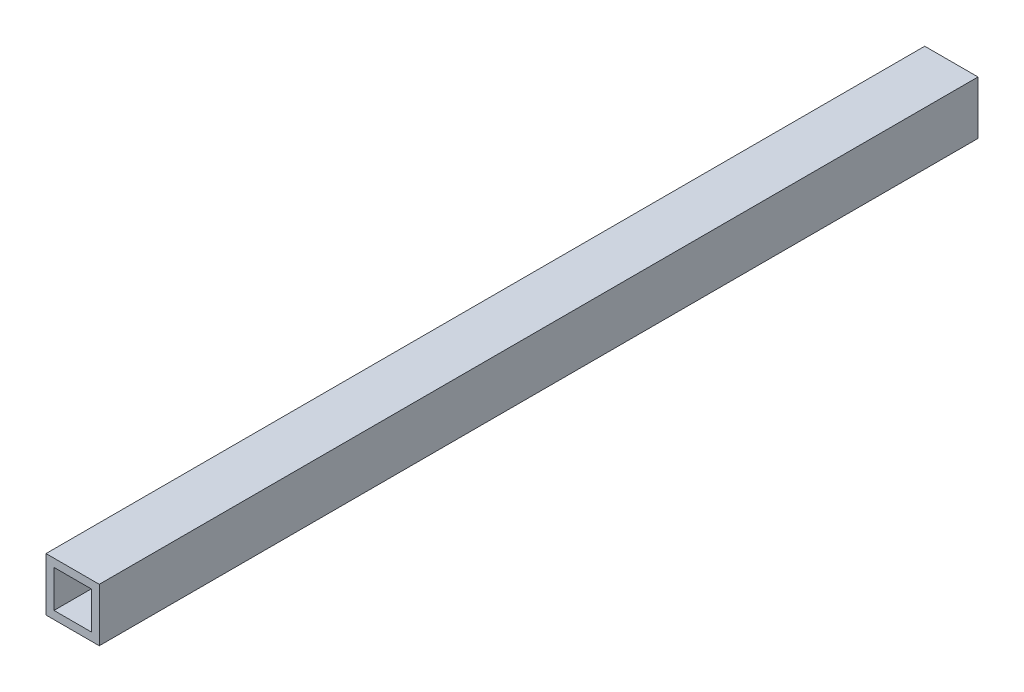
ISO-10303-21;
HEADER;
FILE_DESCRIPTION(('STEP AP214'),'2;1');
FILE_NAME('part.step','',(''),(''),'','','');
FILE_SCHEMA(('AUTOMOTIVE_DESIGN { 1 0 10303 214 1 1 1 1 }'));
ENDSEC;
DATA;
#1=APPLICATION_CONTEXT('core data for automotive mechanical design processes');
#2=APPLICATION_PROTOCOL_DEFINITION('international standard','automotive_design',2000,#1);
#3=PRODUCT_CONTEXT('',#1,'mechanical');
#4=PRODUCT('Part','Part','',(#3));
#5=PRODUCT_RELATED_PRODUCT_CATEGORY('part','',(#4));
#6=PRODUCT_DEFINITION_FORMATION('','',#4);
#7=PRODUCT_DEFINITION_CONTEXT('part definition',#1,'design');
#8=PRODUCT_DEFINITION('design','',#6,#7);
#9=PRODUCT_DEFINITION_SHAPE('','',#8);
#10=(LENGTH_UNIT() NAMED_UNIT(*) SI_UNIT(.MILLI.,.METRE.));
#11=(NAMED_UNIT(*) PLANE_ANGLE_UNIT() SI_UNIT($,.RADIAN.));
#12=(NAMED_UNIT(*) SI_UNIT($,.STERADIAN.) SOLID_ANGLE_UNIT());
#13=UNCERTAINTY_MEASURE_WITH_UNIT(LENGTH_MEASURE(1.E-05),#10,'distance_accuracy_value','');
#14=(GEOMETRIC_REPRESENTATION_CONTEXT(3) GLOBAL_UNCERTAINTY_ASSIGNED_CONTEXT((#13)) GLOBAL_UNIT_ASSIGNED_CONTEXT((#10,
#11,#12)) REPRESENTATION_CONTEXT('',''));
#15=CARTESIAN_POINT('',(0.,0.,0.));
#16=DIRECTION('',(0.,0.,1.));
#17=DIRECTION('',(1.,0.,0.));
#18=AXIS2_PLACEMENT_3D('',#15,#16,#17);
#19=CARTESIAN_POINT('',(0.,0.,165.));
#20=DIRECTION('',(0.,0.,1.));
#21=DIRECTION('',(1.,0.,0.));
#22=AXIS2_PLACEMENT_3D('',#19,#20,#21);
#23=PLANE('',#22);
#24=DIRECTION('',(0.,1.,0.));
#25=VECTOR('',#24,1.);
#26=CARTESIAN_POINT('',(5.,5.,165.));
#27=LINE('',#26,#25);
#28=CARTESIAN_POINT('',(5.,-5.,165.));
#29=VERTEX_POINT('',#28);
#30=CARTESIAN_POINT('',(5.,5.,165.));
#31=VERTEX_POINT('',#30);
#32=EDGE_CURVE('E136',#29,#31,#27,.T.);
#33=ORIENTED_EDGE('',*,*,#32,.T.);
#34=DIRECTION('',(-1.,0.,0.));
#35=VECTOR('',#34,1.);
#36=CARTESIAN_POINT('',(-5.,5.,165.));
#37=LINE('',#36,#35);
#38=CARTESIAN_POINT('',(-5.,5.,165.));
#39=VERTEX_POINT('',#38);
#40=EDGE_CURVE('E139',#31,#39,#37,.T.);
#41=ORIENTED_EDGE('',*,*,#40,.T.);
#42=DIRECTION('',(0.,-1.,0.));
#43=VECTOR('',#42,1.);
#44=CARTESIAN_POINT('',(-5.,5.,165.));
#45=LINE('',#44,#43);
#46=CARTESIAN_POINT('',(-5.,-5.,165.));
#47=VERTEX_POINT('',#46);
#48=EDGE_CURVE('E142',#39,#47,#45,.T.);
#49=ORIENTED_EDGE('',*,*,#48,.T.);
#50=DIRECTION('',(1.,0.,0.));
#51=VECTOR('',#50,1.);
#52=CARTESIAN_POINT('',(-5.,-5.,165.));
#53=LINE('',#52,#51);
#54=EDGE_CURVE('E144',#47,#29,#53,.T.);
#55=ORIENTED_EDGE('',*,*,#54,.T.);
#56=EDGE_LOOP('',(#33,#41,#49,#55));
#57=FACE_BOUND('',#56,.T.);
#58=DIRECTION('',(-1.,0.,0.));
#59=VECTOR('',#58,1.);
#60=CARTESIAN_POINT('',(-3.5,3.5,165.));
#61=LINE('',#60,#59);
#62=CARTESIAN_POINT('',(3.5,3.5,165.));
#63=VERTEX_POINT('',#62);
#64=CARTESIAN_POINT('',(-3.5,3.5,165.));
#65=VERTEX_POINT('',#64);
#66=EDGE_CURVE('E108',#63,#65,#61,.T.);
#67=ORIENTED_EDGE('',*,*,#66,.F.);
#68=DIRECTION('',(0.,1.,0.));
#69=VECTOR('',#68,1.);
#70=CARTESIAN_POINT('',(3.5,3.5,165.));
#71=LINE('',#70,#69);
#72=CARTESIAN_POINT('',(3.5,-3.5,165.));
#73=VERTEX_POINT('',#72);
#74=EDGE_CURVE('E100',#73,#63,#71,.T.);
#75=ORIENTED_EDGE('',*,*,#74,.F.);
#76=DIRECTION('',(1.,0.,0.));
#77=VECTOR('',#76,1.);
#78=CARTESIAN_POINT('',(-3.5,-3.5,165.));
#79=LINE('',#78,#77);
#80=CARTESIAN_POINT('',(-3.5,-3.5,165.));
#81=VERTEX_POINT('',#80);
#82=EDGE_CURVE('E122',#81,#73,#79,.T.);
#83=ORIENTED_EDGE('',*,*,#82,.F.);
#84=DIRECTION('',(0.,-1.,0.));
#85=VECTOR('',#84,1.);
#86=CARTESIAN_POINT('',(-3.5,3.5,165.));
#87=LINE('',#86,#85);
#88=EDGE_CURVE('E120',#65,#81,#87,.T.);
#89=ORIENTED_EDGE('',*,*,#88,.F.);
#90=EDGE_LOOP('',(#67,#75,#83,#89));
#91=FACE_BOUND('',#90,.T.);
#92=ADVANCED_FACE('F35',(#57,#91),#23,.T.);
#93=CARTESIAN_POINT('',(0.,0.,0.));
#94=DIRECTION('',(0.,0.,1.));
#95=DIRECTION('',(1.,0.,0.));
#96=AXIS2_PLACEMENT_3D('',#93,#94,#95);
#97=PLANE('',#96);
#98=DIRECTION('',(0.,1.,0.));
#99=VECTOR('',#98,1.);
#100=CARTESIAN_POINT('',(5.,5.,0.));
#101=LINE('',#100,#99);
#102=CARTESIAN_POINT('',(5.,-5.,0.));
#103=VERTEX_POINT('',#102);
#104=CARTESIAN_POINT('',(5.,5.,0.));
#105=VERTEX_POINT('',#104);
#106=EDGE_CURVE('E116',#103,#105,#101,.T.);
#107=ORIENTED_EDGE('',*,*,#106,.F.);
#108=DIRECTION('',(1.,0.,0.));
#109=VECTOR('',#108,1.);
#110=CARTESIAN_POINT('',(-5.,-5.,0.));
#111=LINE('',#110,#109);
#112=CARTESIAN_POINT('',(-5.,-5.,0.));
#113=VERTEX_POINT('',#112);
#114=EDGE_CURVE('E140',#113,#103,#111,.T.);
#115=ORIENTED_EDGE('',*,*,#114,.F.);
#116=DIRECTION('',(0.,-1.,0.));
#117=VECTOR('',#116,1.);
#118=CARTESIAN_POINT('',(-5.,5.,0.));
#119=LINE('',#118,#117);
#120=CARTESIAN_POINT('',(-5.,5.,0.));
#121=VERTEX_POINT('',#120);
#122=EDGE_CURVE('E151',#121,#113,#119,.T.);
#123=ORIENTED_EDGE('',*,*,#122,.F.);
#124=DIRECTION('',(-1.,0.,0.));
#125=VECTOR('',#124,1.);
#126=CARTESIAN_POINT('',(-5.,5.,0.));
#127=LINE('',#126,#125);
#128=EDGE_CURVE('E149',#105,#121,#127,.T.);
#129=ORIENTED_EDGE('',*,*,#128,.F.);
#130=EDGE_LOOP('',(#107,#115,#123,#129));
#131=FACE_BOUND('',#130,.T.);
#132=DIRECTION('',(0.,1.,0.));
#133=VECTOR('',#132,1.);
#134=CARTESIAN_POINT('',(3.5,3.5,0.));
#135=LINE('',#134,#133);
#136=CARTESIAN_POINT('',(3.5,-3.5,0.));
#137=VERTEX_POINT('',#136);
#138=CARTESIAN_POINT('',(3.5,3.5,0.));
#139=VERTEX_POINT('',#138);
#140=EDGE_CURVE('E58',#137,#139,#135,.T.);
#141=ORIENTED_EDGE('',*,*,#140,.T.);
#142=DIRECTION('',(-1.,0.,0.));
#143=VECTOR('',#142,1.);
#144=CARTESIAN_POINT('',(-3.5,3.5,0.));
#145=LINE('',#144,#143);
#146=CARTESIAN_POINT('',(-3.5,3.5,0.));
#147=VERTEX_POINT('',#146);
#148=EDGE_CURVE('E115',#139,#147,#145,.T.);
#149=ORIENTED_EDGE('',*,*,#148,.T.);
#150=DIRECTION('',(0.,-1.,0.));
#151=VECTOR('',#150,1.);
#152=CARTESIAN_POINT('',(-3.5,3.5,0.));
#153=LINE('',#152,#151);
#154=CARTESIAN_POINT('',(-3.5,-3.5,0.));
#155=VERTEX_POINT('',#154);
#156=EDGE_CURVE('E128',#147,#155,#153,.T.);
#157=ORIENTED_EDGE('',*,*,#156,.T.);
#158=DIRECTION('',(1.,0.,0.));
#159=VECTOR('',#158,1.);
#160=CARTESIAN_POINT('',(-3.5,-3.5,0.));
#161=LINE('',#160,#159);
#162=EDGE_CURVE('E109',#155,#137,#161,.T.);
#163=ORIENTED_EDGE('',*,*,#162,.T.);
#164=EDGE_LOOP('',(#141,#149,#157,#163));
#165=FACE_BOUND('',#164,.T.);
#166=ADVANCED_FACE('F169',(#131,#165),#97,.F.);
#167=CARTESIAN_POINT('',(5.,5.,165.));
#168=DIRECTION('',(-1.,0.,0.));
#169=DIRECTION('',(0.,0.,1.));
#170=AXIS2_PLACEMENT_3D('',#167,#168,#169);
#171=PLANE('',#170);
#172=ORIENTED_EDGE('',*,*,#106,.T.);
#173=DIRECTION('',(0.,0.,-1.));
#174=VECTOR('',#173,1.);
#175=CARTESIAN_POINT('',(5.,5.,165.));
#176=LINE('',#175,#174);
#177=EDGE_CURVE('E11',#31,#105,#176,.T.);
#178=ORIENTED_EDGE('',*,*,#177,.F.);
#179=ORIENTED_EDGE('',*,*,#32,.F.);
#180=DIRECTION('',(0.,0.,-1.));
#181=VECTOR('',#180,1.);
#182=CARTESIAN_POINT('',(5.,-5.,165.));
#183=LINE('',#182,#181);
#184=EDGE_CURVE('E146',#29,#103,#183,.T.);
#185=ORIENTED_EDGE('',*,*,#184,.T.);
#186=EDGE_LOOP('',(#172,#178,#179,#185));
#187=FACE_BOUND('',#186,.T.);
#188=ADVANCED_FACE('F37',(#187),#171,.F.);
#189=CARTESIAN_POINT('',(-5.,5.,165.));
#190=DIRECTION('',(0.,-1.,0.));
#191=DIRECTION('',(0.,0.,-1.));
#192=AXIS2_PLACEMENT_3D('',#189,#190,#191);
#193=PLANE('',#192);
#194=ORIENTED_EDGE('',*,*,#128,.T.);
#195=DIRECTION('',(0.,0.,-1.));
#196=VECTOR('',#195,1.);
#197=CARTESIAN_POINT('',(-5.,5.,165.));
#198=LINE('',#197,#196);
#199=EDGE_CURVE('E43',#39,#121,#198,.T.);
#200=ORIENTED_EDGE('',*,*,#199,.F.);
#201=ORIENTED_EDGE('',*,*,#40,.F.);
#202=ORIENTED_EDGE('',*,*,#177,.T.);
#203=EDGE_LOOP('',(#194,#200,#201,#202));
#204=FACE_BOUND('',#203,.T.);
#205=ADVANCED_FACE('F179',(#204),#193,.F.);
#206=CARTESIAN_POINT('',(-5.,5.,165.));
#207=DIRECTION('',(1.,0.,0.));
#208=DIRECTION('',(0.,0.,-1.));
#209=AXIS2_PLACEMENT_3D('',#206,#207,#208);
#210=PLANE('',#209);
#211=ORIENTED_EDGE('',*,*,#122,.T.);
#212=DIRECTION('',(0.,0.,-1.));
#213=VECTOR('',#212,1.);
#214=CARTESIAN_POINT('',(-5.,-5.,165.));
#215=LINE('',#214,#213);
#216=EDGE_CURVE('E156',#47,#113,#215,.T.);
#217=ORIENTED_EDGE('',*,*,#216,.F.);
#218=ORIENTED_EDGE('',*,*,#48,.F.);
#219=ORIENTED_EDGE('',*,*,#199,.T.);
#220=EDGE_LOOP('',(#211,#217,#218,#219));
#221=FACE_BOUND('',#220,.T.);
#222=ADVANCED_FACE('F163',(#221),#210,.F.);
#223=CARTESIAN_POINT('',(-5.,-5.,165.));
#224=DIRECTION('',(0.,1.,0.));
#225=DIRECTION('',(0.,0.,1.));
#226=AXIS2_PLACEMENT_3D('',#223,#224,#225);
#227=PLANE('',#226);
#228=ORIENTED_EDGE('',*,*,#114,.T.);
#229=ORIENTED_EDGE('',*,*,#184,.F.);
#230=ORIENTED_EDGE('',*,*,#54,.F.);
#231=ORIENTED_EDGE('',*,*,#216,.T.);
#232=EDGE_LOOP('',(#228,#229,#230,#231));
#233=FACE_BOUND('',#232,.T.);
#234=ADVANCED_FACE('F173',(#233),#227,.F.);
#235=CARTESIAN_POINT('',(3.5,3.5,165.));
#236=DIRECTION('',(-1.,0.,0.));
#237=DIRECTION('',(0.,0.,1.));
#238=AXIS2_PLACEMENT_3D('',#235,#236,#237);
#239=PLANE('',#238);
#240=ORIENTED_EDGE('',*,*,#140,.F.);
#241=DIRECTION('',(0.,0.,-1.));
#242=VECTOR('',#241,1.);
#243=CARTESIAN_POINT('',(3.5,-3.5,165.));
#244=LINE('',#243,#242);
#245=EDGE_CURVE('E104',#73,#137,#244,.T.);
#246=ORIENTED_EDGE('',*,*,#245,.F.);
#247=ORIENTED_EDGE('',*,*,#74,.T.);
#248=DIRECTION('',(0.,0.,-1.));
#249=VECTOR('',#248,1.);
#250=CARTESIAN_POINT('',(3.5,3.5,165.));
#251=LINE('',#250,#249);
#252=EDGE_CURVE('E103',#63,#139,#251,.T.);
#253=ORIENTED_EDGE('',*,*,#252,.T.);
#254=EDGE_LOOP('',(#240,#246,#247,#253));
#255=FACE_BOUND('',#254,.T.);
#256=ADVANCED_FACE('F102',(#255),#239,.T.);
#257=CARTESIAN_POINT('',(-3.5,3.5,165.));
#258=DIRECTION('',(0.,-1.,0.));
#259=DIRECTION('',(0.,0.,-1.));
#260=AXIS2_PLACEMENT_3D('',#257,#258,#259);
#261=PLANE('',#260);
#262=ORIENTED_EDGE('',*,*,#148,.F.);
#263=ORIENTED_EDGE('',*,*,#252,.F.);
#264=ORIENTED_EDGE('',*,*,#66,.T.);
#265=DIRECTION('',(0.,0.,-1.));
#266=VECTOR('',#265,1.);
#267=CARTESIAN_POINT('',(-3.5,3.5,165.));
#268=LINE('',#267,#266);
#269=EDGE_CURVE('E117',#65,#147,#268,.T.);
#270=ORIENTED_EDGE('',*,*,#269,.T.);
#271=EDGE_LOOP('',(#262,#263,#264,#270));
#272=FACE_BOUND('',#271,.T.);
#273=ADVANCED_FACE('F112',(#272),#261,.T.);
#274=CARTESIAN_POINT('',(-3.5,3.5,165.));
#275=DIRECTION('',(1.,0.,0.));
#276=DIRECTION('',(0.,0.,-1.));
#277=AXIS2_PLACEMENT_3D('',#274,#275,#276);
#278=PLANE('',#277);
#279=ORIENTED_EDGE('',*,*,#156,.F.);
#280=ORIENTED_EDGE('',*,*,#269,.F.);
#281=ORIENTED_EDGE('',*,*,#88,.T.);
#282=DIRECTION('',(0.,0.,-1.));
#283=VECTOR('',#282,1.);
#284=CARTESIAN_POINT('',(-3.5,-3.5,165.));
#285=LINE('',#284,#283);
#286=EDGE_CURVE('E50',#81,#155,#285,.T.);
#287=ORIENTED_EDGE('',*,*,#286,.T.);
#288=EDGE_LOOP('',(#279,#280,#281,#287));
#289=FACE_BOUND('',#288,.T.);
#290=ADVANCED_FACE('F202',(#289),#278,.T.);
#291=CARTESIAN_POINT('',(-3.5,-3.5,165.));
#292=DIRECTION('',(0.,1.,0.));
#293=DIRECTION('',(0.,0.,1.));
#294=AXIS2_PLACEMENT_3D('',#291,#292,#293);
#295=PLANE('',#294);
#296=ORIENTED_EDGE('',*,*,#162,.F.);
#297=ORIENTED_EDGE('',*,*,#286,.F.);
#298=ORIENTED_EDGE('',*,*,#82,.T.);
#299=ORIENTED_EDGE('',*,*,#245,.T.);
#300=EDGE_LOOP('',(#296,#297,#298,#299));
#301=FACE_BOUND('',#300,.T.);
#302=ADVANCED_FACE('F206',(#301),#295,.T.);
#303=CLOSED_SHELL('',(#92,#166,#188,#205,#222,#234,#256,#273,#290,#302));
#304=MANIFOLD_SOLID_BREP('B2',#303);
#305=ADVANCED_BREP_SHAPE_REPRESENTATION('',(#18,#304),#14);
#306=SHAPE_DEFINITION_REPRESENTATION(#9,#305);
ENDSEC;
END-ISO-10303-21;
